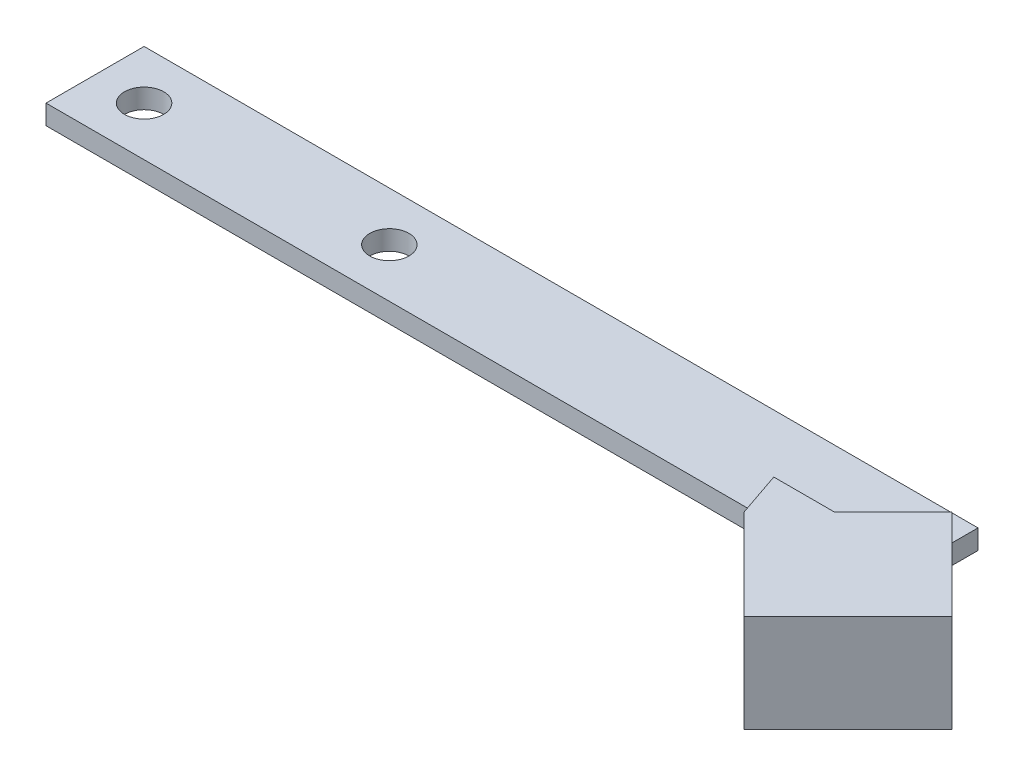
ISO-10303-21;
HEADER;
FILE_DESCRIPTION(('STEP AP214'),'2;1');
FILE_NAME('part.step','',(''),(''),'','','');
FILE_SCHEMA(('AUTOMOTIVE_DESIGN { 1 0 10303 214 1 1 1 1 }'));
ENDSEC;
DATA;
#1=APPLICATION_CONTEXT('core data for automotive mechanical design processes');
#2=APPLICATION_PROTOCOL_DEFINITION('international standard','automotive_design',2000,#1);
#3=PRODUCT_CONTEXT('',#1,'mechanical');
#4=PRODUCT('Part','Part','',(#3));
#5=PRODUCT_RELATED_PRODUCT_CATEGORY('part','',(#4));
#6=PRODUCT_DEFINITION_FORMATION('','',#4);
#7=PRODUCT_DEFINITION_CONTEXT('part definition',#1,'design');
#8=PRODUCT_DEFINITION('design','',#6,#7);
#9=PRODUCT_DEFINITION_SHAPE('','',#8);
#10=(LENGTH_UNIT() NAMED_UNIT(*) SI_UNIT(.MILLI.,.METRE.));
#11=(NAMED_UNIT(*) PLANE_ANGLE_UNIT() SI_UNIT($,.RADIAN.));
#12=(NAMED_UNIT(*) SI_UNIT($,.STERADIAN.) SOLID_ANGLE_UNIT());
#13=UNCERTAINTY_MEASURE_WITH_UNIT(LENGTH_MEASURE(1.E-05),#10,'distance_accuracy_value','');
#14=(GEOMETRIC_REPRESENTATION_CONTEXT(3) GLOBAL_UNCERTAINTY_ASSIGNED_CONTEXT((#13)) GLOBAL_UNIT_ASSIGNED_CONTEXT((#10,
#11,#12)) REPRESENTATION_CONTEXT('',''));
#15=CARTESIAN_POINT('',(0.,0.,0.));
#16=DIRECTION('',(0.,0.,1.));
#17=DIRECTION('',(1.,0.,0.));
#18=AXIS2_PLACEMENT_3D('',#15,#16,#17);
#19=CARTESIAN_POINT('',(0.,2.,0.));
#20=DIRECTION('',(0.,1.,0.));
#21=DIRECTION('',(0.,0.,1.));
#22=AXIS2_PLACEMENT_3D('',#19,#20,#21);
#23=PLANE('',#22);
#24=DIRECTION('',(0.323506374547266,0.,0.946225990779837));
#25=VECTOR('',#24,1.);
#26=CARTESIAN_POINT('',(43.7119643957007,2.,-14.9447375825492));
#27=LINE('',#26,#25);
#28=CARTESIAN_POINT('',(49.7625278957282,2.,2.75259666813454));
#29=VERTEX_POINT('',#28);
#30=CARTESIAN_POINT('',(49.8286724490483,2.,2.94606332111017));
#31=VERTEX_POINT('',#30);
#32=EDGE_CURVE('E168',#29,#31,#27,.T.);
#33=ORIENTED_EDGE('',*,*,#32,.F.);
#34=DIRECTION('',(-1.,0.,0.));
#35=VECTOR('',#34,1.);
#36=CARTESIAN_POINT('',(0.,2.,2.75259666813454));
#37=LINE('',#36,#35);
#38=CARTESIAN_POINT('',(55.9642852064059,2.,2.75259666813454));
#39=VERTEX_POINT('',#38);
#40=EDGE_CURVE('E162',#39,#29,#37,.T.);
#41=ORIENTED_EDGE('',*,*,#40,.F.);
#42=DIRECTION('',(-0.707106781186544,0.,0.707106781186551));
#43=VECTOR('',#42,1.);
#44=CARTESIAN_POINT('',(60.7708185534303,2.,-2.05393667888983));
#45=LINE('',#44,#43);
#46=CARTESIAN_POINT('',(60.7708185534303,2.,-2.05393667888982));
#47=VERTEX_POINT('',#46);
#48=EDGE_CURVE('E199',#47,#39,#45,.T.);
#49=ORIENTED_EDGE('',*,*,#48,.F.);
#50=DIRECTION('',(0.,0.,-1.));
#51=VECTOR('',#50,1.);
#52=CARTESIAN_POINT('',(60.7708185534303,2.,-7.05393667888983));
#53=LINE('',#52,#51);
#54=CARTESIAN_POINT('',(60.7708185534303,2.,-7.05393667888983));
#55=VERTEX_POINT('',#54);
#56=EDGE_CURVE('E223',#47,#55,#53,.T.);
#57=ORIENTED_EDGE('',*,*,#56,.T.);
#58=DIRECTION('',(-1.,0.,0.));
#59=VECTOR('',#58,1.);
#60=CARTESIAN_POINT('',(-24.2291814465697,2.,-7.05393667888983));
#61=LINE('',#60,#59);
#62=CARTESIAN_POINT('',(-24.2291814465697,2.,-7.05393667888983));
#63=VERTEX_POINT('',#62);
#64=EDGE_CURVE('E225',#55,#63,#61,.T.);
#65=ORIENTED_EDGE('',*,*,#64,.T.);
#66=DIRECTION('',(0.,0.,1.));
#67=VECTOR('',#66,1.);
#68=CARTESIAN_POINT('',(-24.2291814465697,2.,-7.05393667888983));
#69=LINE('',#68,#67);
#70=CARTESIAN_POINT('',(-24.2291814465697,2.,2.94606332111017));
#71=VERTEX_POINT('',#70);
#72=EDGE_CURVE('E216',#63,#71,#69,.T.);
#73=ORIENTED_EDGE('',*,*,#72,.T.);
#74=DIRECTION('',(1.,0.,0.));
#75=VECTOR('',#74,1.);
#76=CARTESIAN_POINT('',(-24.2291814465697,2.,2.94606332111017));
#77=LINE('',#76,#75);
#78=EDGE_CURVE('E219',#71,#31,#77,.T.);
#79=ORIENTED_EDGE('',*,*,#78,.T.);
#80=EDGE_LOOP('',(#33,#41,#49,#57,#65,#73,#79));
#81=FACE_BOUND('',#80,.T.);
#82=CARTESIAN_POINT('',(-19.2291814465697,2.,-2.05393667888983));
#83=DIRECTION('',(0.,1.,0.));
#84=DIRECTION('',(0.,0.,1.));
#85=AXIS2_PLACEMENT_3D('',#82,#83,#84);
#86=CIRCLE('',#85,2.);
#87=CARTESIAN_POINT('',(-19.2291814465697,2.,-0.0539366788898303));
#88=VERTEX_POINT('',#87);
#89=EDGE_CURVE('E210',#88,#88,#86,.T.);
#90=ORIENTED_EDGE('',*,*,#89,.F.);
#91=EDGE_LOOP('',(#90));
#92=FACE_BOUND('',#91,.T.);
#93=CARTESIAN_POINT('',(5.77081855343026,2.,-2.05393667888983));
#94=DIRECTION('',(0.,1.,0.));
#95=DIRECTION('',(0.,0.,1.));
#96=AXIS2_PLACEMENT_3D('',#93,#94,#95);
#97=CIRCLE('',#96,2.);
#98=CARTESIAN_POINT('',(5.77081855343026,2.,-0.0539366788898329));
#99=VERTEX_POINT('',#98);
#100=EDGE_CURVE('E204',#99,#99,#97,.T.);
#101=ORIENTED_EDGE('',*,*,#100,.F.);
#102=EDGE_LOOP('',(#101));
#103=FACE_BOUND('',#102,.T.);
#104=ADVANCED_FACE('F34',(#81,#92,#103),#23,.T.);
#105=CARTESIAN_POINT('',(0.,0.,0.));
#106=DIRECTION('',(0.,1.,0.));
#107=DIRECTION('',(0.,0.,1.));
#108=AXIS2_PLACEMENT_3D('',#105,#106,#107);
#109=PLANE('',#108);
#110=DIRECTION('',(-1.,0.,0.));
#111=VECTOR('',#110,1.);
#112=CARTESIAN_POINT('',(0.,0.,2.75259666813454));
#113=LINE('',#112,#111);
#114=CARTESIAN_POINT('',(55.9642852064059,0.,2.75259666813454));
#115=VERTEX_POINT('',#114);
#116=CARTESIAN_POINT('',(49.7625278957282,0.,2.75259666813454));
#117=VERTEX_POINT('',#116);
#118=EDGE_CURVE('E138',#115,#117,#113,.T.);
#119=ORIENTED_EDGE('',*,*,#118,.T.);
#120=DIRECTION('',(0.323506374547266,0.,0.946225990779837));
#121=VECTOR('',#120,1.);
#122=CARTESIAN_POINT('',(43.7119643957007,0.,-14.9447375825492));
#123=LINE('',#122,#121);
#124=CARTESIAN_POINT('',(49.8286724490483,0.,2.94606332111017));
#125=VERTEX_POINT('',#124);
#126=EDGE_CURVE('E135',#117,#125,#123,.T.);
#127=ORIENTED_EDGE('',*,*,#126,.T.);
#128=DIRECTION('',(1.,0.,0.));
#129=VECTOR('',#128,1.);
#130=CARTESIAN_POINT('',(-24.2291814465697,0.,2.94606332111017));
#131=LINE('',#130,#129);
#132=CARTESIAN_POINT('',(-24.2291814465697,0.,2.94606332111017));
#133=VERTEX_POINT('',#132);
#134=EDGE_CURVE('E230',#133,#125,#131,.T.);
#135=ORIENTED_EDGE('',*,*,#134,.F.);
#136=DIRECTION('',(0.,0.,1.));
#137=VECTOR('',#136,1.);
#138=CARTESIAN_POINT('',(-24.2291814465697,0.,-7.05393667888983));
#139=LINE('',#138,#137);
#140=CARTESIAN_POINT('',(-24.2291814465697,0.,-7.05393667888983));
#141=VERTEX_POINT('',#140);
#142=EDGE_CURVE('E213',#141,#133,#139,.T.);
#143=ORIENTED_EDGE('',*,*,#142,.F.);
#144=DIRECTION('',(-1.,0.,0.));
#145=VECTOR('',#144,1.);
#146=CARTESIAN_POINT('',(-24.2291814465697,0.,-7.05393667888983));
#147=LINE('',#146,#145);
#148=CARTESIAN_POINT('',(60.7708185534303,0.,-7.05393667888983));
#149=VERTEX_POINT('',#148);
#150=EDGE_CURVE('E220',#149,#141,#147,.T.);
#151=ORIENTED_EDGE('',*,*,#150,.F.);
#152=DIRECTION('',(0.,0.,-1.));
#153=VECTOR('',#152,1.);
#154=CARTESIAN_POINT('',(60.7708185534303,0.,-7.05393667888983));
#155=LINE('',#154,#153);
#156=CARTESIAN_POINT('',(60.7708185534303,0.,-2.05393667888983));
#157=VERTEX_POINT('',#156);
#158=EDGE_CURVE('E233',#157,#149,#155,.T.);
#159=ORIENTED_EDGE('',*,*,#158,.F.);
#160=DIRECTION('',(-0.707106781186544,0.,0.707106781186551));
#161=VECTOR('',#160,1.);
#162=CARTESIAN_POINT('',(29.3584409372705,0.,29.3584409372702));
#163=LINE('',#162,#161);
#164=EDGE_CURVE('E57',#157,#115,#163,.T.);
#165=ORIENTED_EDGE('',*,*,#164,.T.);
#166=EDGE_LOOP('',(#119,#127,#135,#143,#151,#159,#165));
#167=FACE_BOUND('',#166,.T.);
#168=CARTESIAN_POINT('',(-19.2291814465697,0.,-2.05393667888983));
#169=DIRECTION('',(0.,1.,0.));
#170=DIRECTION('',(0.,0.,1.));
#171=AXIS2_PLACEMENT_3D('',#168,#169,#170);
#172=CIRCLE('',#171,2.);
#173=CARTESIAN_POINT('',(-19.2291814465697,0.,-0.0539366788898303));
#174=VERTEX_POINT('',#173);
#175=EDGE_CURVE('E207',#174,#174,#172,.T.);
#176=ORIENTED_EDGE('',*,*,#175,.T.);
#177=EDGE_LOOP('',(#176));
#178=FACE_BOUND('',#177,.T.);
#179=CARTESIAN_POINT('',(5.77081855343026,0.,-2.05393667888983));
#180=DIRECTION('',(0.,1.,0.));
#181=DIRECTION('',(0.,0.,1.));
#182=AXIS2_PLACEMENT_3D('',#179,#180,#181);
#183=CIRCLE('',#182,2.);
#184=CARTESIAN_POINT('',(5.77081855343026,0.,-0.0539366788898329));
#185=VERTEX_POINT('',#184);
#186=EDGE_CURVE('E203',#185,#185,#183,.T.);
#187=ORIENTED_EDGE('',*,*,#186,.T.);
#188=EDGE_LOOP('',(#187));
#189=FACE_BOUND('',#188,.T.);
#190=ADVANCED_FACE('F250',(#167,#178,#189),#109,.F.);
#191=CARTESIAN_POINT('',(-24.2291814465697,2.,-7.05393667888983));
#192=DIRECTION('',(1.,0.,0.));
#193=DIRECTION('',(0.,0.,-1.));
#194=AXIS2_PLACEMENT_3D('',#191,#192,#193);
#195=PLANE('',#194);
#196=ORIENTED_EDGE('',*,*,#142,.T.);
#197=DIRECTION('',(0.,-1.,0.));
#198=VECTOR('',#197,1.);
#199=CARTESIAN_POINT('',(-24.2291814465697,2.,2.94606332111017));
#200=LINE('',#199,#198);
#201=EDGE_CURVE('E42',#71,#133,#200,.T.);
#202=ORIENTED_EDGE('',*,*,#201,.F.);
#203=ORIENTED_EDGE('',*,*,#72,.F.);
#204=DIRECTION('',(0.,-1.,0.));
#205=VECTOR('',#204,1.);
#206=CARTESIAN_POINT('',(-24.2291814465697,2.,-7.05393667888983));
#207=LINE('',#206,#205);
#208=EDGE_CURVE('E227',#63,#141,#207,.T.);
#209=ORIENTED_EDGE('',*,*,#208,.T.);
#210=EDGE_LOOP('',(#196,#202,#203,#209));
#211=FACE_BOUND('',#210,.T.);
#212=ADVANCED_FACE('F36',(#211),#195,.F.);
#213=CARTESIAN_POINT('',(-24.2291814465697,2.,2.94606332111017));
#214=DIRECTION('',(0.,0.,-1.));
#215=DIRECTION('',(-1.,0.,0.));
#216=AXIS2_PLACEMENT_3D('',#213,#214,#215);
#217=PLANE('',#216);
#218=ORIENTED_EDGE('',*,*,#134,.T.);
#219=DIRECTION('',(0.,1.,0.));
#220=VECTOR('',#219,1.);
#221=CARTESIAN_POINT('',(49.8286724490483,1.99999999999999,2.94606332111017));
#222=LINE('',#221,#220);
#223=EDGE_CURVE('E164',#125,#31,#222,.T.);
#224=ORIENTED_EDGE('',*,*,#223,.T.);
#225=ORIENTED_EDGE('',*,*,#78,.F.);
#226=ORIENTED_EDGE('',*,*,#201,.T.);
#227=EDGE_LOOP('',(#218,#224,#225,#226));
#228=FACE_BOUND('',#227,.T.);
#229=ADVANCED_FACE('F243',(#228),#217,.F.);
#230=CARTESIAN_POINT('',(60.7708185534303,2.,-7.05393667888983));
#231=DIRECTION('',(-1.,0.,0.));
#232=DIRECTION('',(0.,0.,1.));
#233=AXIS2_PLACEMENT_3D('',#230,#231,#232);
#234=PLANE('',#233);
#235=ORIENTED_EDGE('',*,*,#56,.F.);
#236=DIRECTION('',(0.,-1.,0.));
#237=VECTOR('',#236,1.);
#238=CARTESIAN_POINT('',(60.7708185534303,2.,-2.05393667888983));
#239=LINE('',#238,#237);
#240=EDGE_CURVE('E11',#47,#157,#239,.T.);
#241=ORIENTED_EDGE('',*,*,#240,.T.);
#242=ORIENTED_EDGE('',*,*,#158,.T.);
#243=DIRECTION('',(0.,-1.,0.));
#244=VECTOR('',#243,1.);
#245=CARTESIAN_POINT('',(60.7708185534303,2.,-7.05393667888983));
#246=LINE('',#245,#244);
#247=EDGE_CURVE('E238',#55,#149,#246,.T.);
#248=ORIENTED_EDGE('',*,*,#247,.F.);
#249=EDGE_LOOP('',(#235,#241,#242,#248));
#250=FACE_BOUND('',#249,.T.);
#251=ADVANCED_FACE('F279',(#250),#234,.F.);
#252=CARTESIAN_POINT('',(-24.2291814465697,2.,-7.05393667888983));
#253=DIRECTION('',(0.,0.,1.));
#254=DIRECTION('',(1.,0.,0.));
#255=AXIS2_PLACEMENT_3D('',#252,#253,#254);
#256=PLANE('',#255);
#257=ORIENTED_EDGE('',*,*,#150,.T.);
#258=ORIENTED_EDGE('',*,*,#208,.F.);
#259=ORIENTED_EDGE('',*,*,#64,.F.);
#260=ORIENTED_EDGE('',*,*,#247,.T.);
#261=EDGE_LOOP('',(#257,#258,#259,#260));
#262=FACE_BOUND('',#261,.T.);
#263=ADVANCED_FACE('F282',(#262),#256,.F.);
#264=CARTESIAN_POINT('',(-19.2291814465697,2.,-2.05393667888983));
#265=DIRECTION('',(0.,-1.,0.));
#266=DIRECTION('',(0.,0.,-1.));
#267=AXIS2_PLACEMENT_3D('',#264,#265,#266);
#268=CYLINDRICAL_SURFACE('',#267,2.);
#269=ORIENTED_EDGE('',*,*,#89,.T.);
#270=EDGE_LOOP('',(#269));
#271=FACE_BOUND('',#270,.T.);
#272=ORIENTED_EDGE('',*,*,#175,.F.);
#273=EDGE_LOOP('',(#272));
#274=FACE_BOUND('',#273,.T.);
#275=ADVANCED_FACE('F284',(#271,#274),#268,.F.);
#276=CARTESIAN_POINT('',(5.77081855343026,2.,-2.05393667888983));
#277=DIRECTION('',(0.,-1.,0.));
#278=DIRECTION('',(0.,0.,-1.));
#279=AXIS2_PLACEMENT_3D('',#276,#277,#278);
#280=CYLINDRICAL_SURFACE('',#279,2.);
#281=ORIENTED_EDGE('',*,*,#100,.T.);
#282=EDGE_LOOP('',(#281));
#283=FACE_BOUND('',#282,.T.);
#284=ORIENTED_EDGE('',*,*,#186,.F.);
#285=EDGE_LOOP('',(#284));
#286=FACE_BOUND('',#285,.T.);
#287=ADVANCED_FACE('F290',(#283,#286),#280,.F.);
#288=CARTESIAN_POINT('',(29.3584409372705,0.,29.3584409372702));
#289=DIRECTION('',(0.707106781186551,0.,0.707106781186544));
#290=DIRECTION('',(0.707106781186544,0.,-0.707106781186551));
#291=AXIS2_PLACEMENT_3D('',#288,#289,#290);
#292=PLANE('',#291);
#293=DIRECTION('',(0.707106781186544,0.,-0.707106781186551));
#294=VECTOR('',#293,1.);
#295=CARTESIAN_POINT('',(61.9492326952356,-4.11169275093925,-3.23235082069523));
#296=LINE('',#295,#294);
#297=CARTESIAN_POINT('',(55.9642852064059,-4.11169275093925,2.75259666813454));
#298=VERTEX_POINT('',#297);
#299=CARTESIAN_POINT('',(61.9492326952356,-4.11169275093925,-3.23235082069523));
#300=VERTEX_POINT('',#299);
#301=EDGE_CURVE('E175',#298,#300,#296,.T.);
#302=ORIENTED_EDGE('',*,*,#301,.F.);
#303=DIRECTION('',(0.,1.,0.));
#304=VECTOR('',#303,1.);
#305=CARTESIAN_POINT('',(55.9642852064059,-4.11169275093925,2.75259666813454));
#306=LINE('',#305,#304);
#307=EDGE_CURVE('E142',#298,#115,#306,.T.);
#308=ORIENTED_EDGE('',*,*,#307,.T.);
#309=ORIENTED_EDGE('',*,*,#164,.F.);
#310=ORIENTED_EDGE('',*,*,#240,.F.);
#311=ORIENTED_EDGE('',*,*,#48,.T.);
#312=CARTESIAN_POINT('',(55.9642852064059,5.88830724906075,2.75259666813454));
#313=VERTEX_POINT('',#312);
#314=EDGE_CURVE('E151',#39,#313,#306,.T.);
#315=ORIENTED_EDGE('',*,*,#314,.T.);
#316=DIRECTION('',(-0.707106781186544,0.,0.707106781186551));
#317=VECTOR('',#316,1.);
#318=CARTESIAN_POINT('',(61.9492326952356,5.88830724906075,-3.23235082069523));
#319=LINE('',#318,#317);
#320=CARTESIAN_POINT('',(61.9492326952356,5.88830724906075,-3.23235082069523));
#321=VERTEX_POINT('',#320);
#322=EDGE_CURVE('E184',#321,#313,#319,.T.);
#323=ORIENTED_EDGE('',*,*,#322,.F.);
#324=DIRECTION('',(0.,1.,0.));
#325=VECTOR('',#324,1.);
#326=CARTESIAN_POINT('',(61.9492326952356,-4.11169275093925,-3.23235082069523));
#327=LINE('',#326,#325);
#328=EDGE_CURVE('E170',#300,#321,#327,.T.);
#329=ORIENTED_EDGE('',*,*,#328,.F.);
#330=EDGE_LOOP('',(#302,#308,#309,#310,#311,#315,#323,#329));
#331=FACE_BOUND('',#330,.T.);
#332=ADVANCED_FACE('F253',(#331),#292,.F.);
#333=CARTESIAN_POINT('',(71.1416208506608,-4.11169275093925,5.96003733472984));
#334=DIRECTION('',(-0.707106781186544,0.,0.707106781186551));
#335=DIRECTION('',(0.707106781186551,0.,0.707106781186544));
#336=AXIS2_PLACEMENT_3D('',#333,#334,#335);
#337=PLANE('',#336);
#338=ORIENTED_EDGE('',*,*,#328,.T.);
#339=DIRECTION('',(-0.707106781186551,0.,-0.707106781186544));
#340=VECTOR('',#339,1.);
#341=CARTESIAN_POINT('',(71.1416208506608,5.88830724906075,5.96003733472984));
#342=LINE('',#341,#340);
#343=CARTESIAN_POINT('',(71.1416208506608,5.88830724906075,5.96003733472984));
#344=VERTEX_POINT('',#343);
#345=EDGE_CURVE('E196',#344,#321,#342,.T.);
#346=ORIENTED_EDGE('',*,*,#345,.F.);
#347=DIRECTION('',(0.,1.,0.));
#348=VECTOR('',#347,1.);
#349=CARTESIAN_POINT('',(71.1416208506608,-4.11169275093925,5.96003733472984));
#350=LINE('',#349,#348);
#351=CARTESIAN_POINT('',(71.1416208506608,-4.11169275093925,5.96003733472984));
#352=VERTEX_POINT('',#351);
#353=EDGE_CURVE('E171',#352,#344,#350,.T.);
#354=ORIENTED_EDGE('',*,*,#353,.F.);
#355=DIRECTION('',(-0.707106781186551,0.,-0.707106781186544));
#356=VECTOR('',#355,1.);
#357=CARTESIAN_POINT('',(71.1416208506608,-4.11169275093925,5.96003733472984));
#358=LINE('',#357,#356);
#359=EDGE_CURVE('E181',#352,#300,#358,.T.);
#360=ORIENTED_EDGE('',*,*,#359,.T.);
#361=EDGE_LOOP('',(#338,#346,#354,#360));
#362=FACE_BOUND('',#361,.T.);
#363=ADVANCED_FACE('F258',(#362),#337,.F.);
#364=CARTESIAN_POINT('',(71.1416208506608,5.88830724906075,5.96003733472984));
#365=DIRECTION('',(0.,-1.,0.));
#366=DIRECTION('',(0.,0.,-1.));
#367=AXIS2_PLACEMENT_3D('',#364,#365,#366);
#368=PLANE('',#367);
#369=ORIENTED_EDGE('',*,*,#322,.T.);
#370=DIRECTION('',(-1.,0.,0.));
#371=VECTOR('',#370,1.);
#372=CARTESIAN_POINT('',(49.7625278957282,5.88830724906075,2.75259666813454));
#373=LINE('',#372,#371);
#374=CARTESIAN_POINT('',(49.7625278957282,5.88830724906075,2.75259666813454));
#375=VERTEX_POINT('',#374);
#376=EDGE_CURVE('E156',#313,#375,#373,.T.);
#377=ORIENTED_EDGE('',*,*,#376,.T.);
#378=DIRECTION('',(0.323506374547265,0.,0.946225990779837));
#379=VECTOR('',#378,1.);
#380=CARTESIAN_POINT('',(51.3426309774375,5.88830724906075,7.37425089710304));
#381=LINE('',#380,#379);
#382=CARTESIAN_POINT('',(51.3426309774375,5.88830724906075,7.37425089710304));
#383=VERTEX_POINT('',#382);
#384=EDGE_CURVE('E144',#375,#383,#381,.T.);
#385=ORIENTED_EDGE('',*,*,#384,.T.);
#386=DIRECTION('',(-0.707106781186551,0.,-0.707106781186544));
#387=VECTOR('',#386,1.);
#388=CARTESIAN_POINT('',(60.5350191328627,5.88830724906075,16.5666390525281));
#389=LINE('',#388,#387);
#390=CARTESIAN_POINT('',(60.5350191328627,5.88830724906075,16.5666390525281));
#391=VERTEX_POINT('',#390);
#392=EDGE_CURVE('E193',#391,#383,#389,.T.);
#393=ORIENTED_EDGE('',*,*,#392,.F.);
#394=DIRECTION('',(-0.707106781186544,0.,0.707106781186551));
#395=VECTOR('',#394,1.);
#396=CARTESIAN_POINT('',(71.1416208506608,5.88830724906075,5.96003733472984));
#397=LINE('',#396,#395);
#398=EDGE_CURVE('E174',#344,#391,#397,.T.);
#399=ORIENTED_EDGE('',*,*,#398,.F.);
#400=ORIENTED_EDGE('',*,*,#345,.T.);
#401=EDGE_LOOP('',(#369,#377,#385,#393,#399,#400));
#402=FACE_BOUND('',#401,.T.);
#403=ADVANCED_FACE('F268',(#402),#368,.F.);
#404=CARTESIAN_POINT('',(60.5350191328627,-4.11169275093925,16.5666390525281));
#405=DIRECTION('',(0.707106781186544,0.,-0.707106781186551));
#406=DIRECTION('',(-0.707106781186551,0.,-0.707106781186544));
#407=AXIS2_PLACEMENT_3D('',#404,#405,#406);
#408=PLANE('',#407);
#409=DIRECTION('',(0.,-1.,0.));
#410=VECTOR('',#409,1.);
#411=CARTESIAN_POINT('',(51.3426309774375,-4.11169275093925,7.37425089710304));
#412=LINE('',#411,#410);
#413=CARTESIAN_POINT('',(51.3426309774375,-4.11169275093925,7.37425089710304));
#414=VERTEX_POINT('',#413);
#415=EDGE_CURVE('E187',#383,#414,#412,.T.);
#416=ORIENTED_EDGE('',*,*,#415,.T.);
#417=DIRECTION('',(-0.707106781186551,0.,-0.707106781186544));
#418=VECTOR('',#417,1.);
#419=CARTESIAN_POINT('',(60.5350191328627,-4.11169275093925,16.5666390525281));
#420=LINE('',#419,#418);
#421=CARTESIAN_POINT('',(60.5350191328627,-4.11169275093925,16.5666390525281));
#422=VERTEX_POINT('',#421);
#423=EDGE_CURVE('E150',#422,#414,#420,.T.);
#424=ORIENTED_EDGE('',*,*,#423,.F.);
#425=DIRECTION('',(0.,-1.,0.));
#426=VECTOR('',#425,1.);
#427=CARTESIAN_POINT('',(60.5350191328627,-4.11169275093925,16.5666390525281));
#428=LINE('',#427,#426);
#429=EDGE_CURVE('E177',#391,#422,#428,.T.);
#430=ORIENTED_EDGE('',*,*,#429,.F.);
#431=ORIENTED_EDGE('',*,*,#392,.T.);
#432=EDGE_LOOP('',(#416,#424,#430,#431));
#433=FACE_BOUND('',#432,.T.);
#434=ADVANCED_FACE('F265',(#433),#408,.F.);
#435=CARTESIAN_POINT('',(71.1416208506608,-4.11169275093925,5.96003733472984));
#436=DIRECTION('',(0.,1.,0.));
#437=DIRECTION('',(0.,0.,1.));
#438=AXIS2_PLACEMENT_3D('',#435,#436,#437);
#439=PLANE('',#438);
#440=ORIENTED_EDGE('',*,*,#423,.T.);
#441=DIRECTION('',(0.323506374547265,0.,0.946225990779837));
#442=VECTOR('',#441,1.);
#443=CARTESIAN_POINT('',(51.3426309774375,-4.11169275093925,7.37425089710304));
#444=LINE('',#443,#442);
#445=CARTESIAN_POINT('',(49.7625278957282,-4.11169275093925,2.75259666813454));
#446=VERTEX_POINT('',#445);
#447=EDGE_CURVE('E132',#446,#414,#444,.T.);
#448=ORIENTED_EDGE('',*,*,#447,.F.);
#449=DIRECTION('',(-1.,0.,0.));
#450=VECTOR('',#449,1.);
#451=CARTESIAN_POINT('',(49.7625278957282,-4.11169275093925,2.75259666813454));
#452=LINE('',#451,#450);
#453=EDGE_CURVE('E49',#298,#446,#452,.T.);
#454=ORIENTED_EDGE('',*,*,#453,.F.);
#455=ORIENTED_EDGE('',*,*,#301,.T.);
#456=ORIENTED_EDGE('',*,*,#359,.F.);
#457=DIRECTION('',(0.707106781186544,0.,-0.707106781186551));
#458=VECTOR('',#457,1.);
#459=CARTESIAN_POINT('',(71.1416208506608,-4.11169275093925,5.96003733472984));
#460=LINE('',#459,#458);
#461=EDGE_CURVE('E179',#422,#352,#460,.T.);
#462=ORIENTED_EDGE('',*,*,#461,.F.);
#463=EDGE_LOOP('',(#440,#448,#454,#455,#456,#462));
#464=FACE_BOUND('',#463,.T.);
#465=ADVANCED_FACE('F147',(#464),#439,.F.);
#466=CARTESIAN_POINT('',(38.5508290926957,0.,38.5508290926953));
#467=DIRECTION('',(0.707106781186551,0.,0.707106781186544));
#468=DIRECTION('',(0.707106781186544,0.,-0.707106781186551));
#469=AXIS2_PLACEMENT_3D('',#466,#467,#468);
#470=PLANE('',#469);
#471=ORIENTED_EDGE('',*,*,#353,.T.);
#472=ORIENTED_EDGE('',*,*,#398,.T.);
#473=ORIENTED_EDGE('',*,*,#429,.T.);
#474=ORIENTED_EDGE('',*,*,#461,.T.);
#475=EDGE_LOOP('',(#471,#472,#473,#474));
#476=FACE_BOUND('',#475,.T.);
#477=ADVANCED_FACE('F261',(#476),#470,.T.);
#478=CARTESIAN_POINT('',(49.7625278957282,-4.11169275093925,2.75259666813454));
#479=DIRECTION('',(0.,0.,-1.));
#480=DIRECTION('',(0.,1.,0.));
#481=AXIS2_PLACEMENT_3D('',#478,#479,#480);
#482=PLANE('',#481);
#483=ORIENTED_EDGE('',*,*,#118,.F.);
#484=ORIENTED_EDGE('',*,*,#307,.F.);
#485=ORIENTED_EDGE('',*,*,#453,.T.);
#486=DIRECTION('',(0.,1.,0.));
#487=VECTOR('',#486,1.);
#488=CARTESIAN_POINT('',(49.7625278957282,-4.11169275093925,2.75259666813454));
#489=LINE('',#488,#487);
#490=EDGE_CURVE('E129',#446,#117,#489,.T.);
#491=ORIENTED_EDGE('',*,*,#490,.T.);
#492=EDGE_LOOP('',(#483,#484,#485,#491));
#493=FACE_BOUND('',#492,.T.);
#494=ADVANCED_FACE('F141',(#493),#482,.T.);
#495=CARTESIAN_POINT('',(51.3426309774375,-4.11169275093925,7.37425089710304));
#496=DIRECTION('',(-0.946225990779837,0.,0.323506374547266));
#497=DIRECTION('',(0.323506374547266,0.,0.946225990779837));
#498=AXIS2_PLACEMENT_3D('',#495,#496,#497);
#499=PLANE('',#498);
#500=EDGE_CURVE('E139',#29,#375,#489,.T.);
#501=ORIENTED_EDGE('',*,*,#500,.F.);
#502=ORIENTED_EDGE('',*,*,#32,.T.);
#503=ORIENTED_EDGE('',*,*,#223,.F.);
#504=ORIENTED_EDGE('',*,*,#126,.F.);
#505=ORIENTED_EDGE('',*,*,#490,.F.);
#506=ORIENTED_EDGE('',*,*,#447,.T.);
#507=ORIENTED_EDGE('',*,*,#415,.F.);
#508=ORIENTED_EDGE('',*,*,#384,.F.);
#509=EDGE_LOOP('',(#501,#502,#503,#504,#505,#506,#507,#508));
#510=FACE_BOUND('',#509,.T.);
#511=ADVANCED_FACE('F131',(#510),#499,.T.);
#512=ORIENTED_EDGE('',*,*,#314,.F.);
#513=ORIENTED_EDGE('',*,*,#40,.T.);
#514=ORIENTED_EDGE('',*,*,#500,.T.);
#515=ORIENTED_EDGE('',*,*,#376,.F.);
#516=EDGE_LOOP('',(#512,#513,#514,#515));
#517=FACE_BOUND('',#516,.T.);
#518=ADVANCED_FACE('F270',(#517),#482,.T.);
#519=CLOSED_SHELL('',(#104,#190,#212,#229,#251,#263,#275,#287,#332,#363,#403,#434,#465,#477,
#494,#511,#518));
#520=MANIFOLD_SOLID_BREP('B2',#519);
#521=ADVANCED_BREP_SHAPE_REPRESENTATION('',(#18,#520),#14);
#522=SHAPE_DEFINITION_REPRESENTATION(#9,#521);
ENDSEC;
END-ISO-10303-21;
